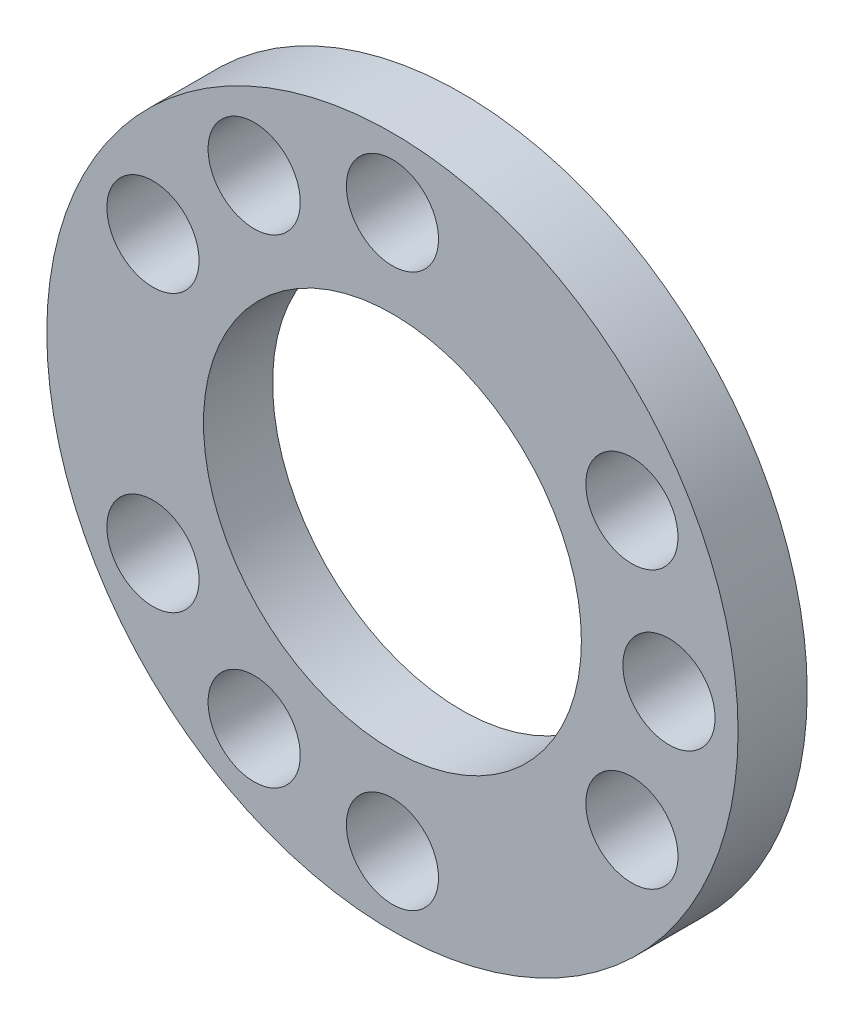
ISO-10303-21;
HEADER;
FILE_DESCRIPTION(('STEP AP214'),'2;1');
FILE_NAME('part.step','',(''),(''),'','','');
FILE_SCHEMA(('AUTOMOTIVE_DESIGN { 1 0 10303 214 1 1 1 1 }'));
ENDSEC;
DATA;
#1=APPLICATION_CONTEXT('core data for automotive mechanical design processes');
#2=APPLICATION_PROTOCOL_DEFINITION('international standard','automotive_design',2000,#1);
#3=PRODUCT_CONTEXT('',#1,'mechanical');
#4=PRODUCT('Part','Part','',(#3));
#5=PRODUCT_RELATED_PRODUCT_CATEGORY('part','',(#4));
#6=PRODUCT_DEFINITION_FORMATION('','',#4);
#7=PRODUCT_DEFINITION_CONTEXT('part definition',#1,'design');
#8=PRODUCT_DEFINITION('design','',#6,#7);
#9=PRODUCT_DEFINITION_SHAPE('','',#8);
#10=(LENGTH_UNIT() NAMED_UNIT(*) SI_UNIT(.MILLI.,.METRE.));
#11=(NAMED_UNIT(*) PLANE_ANGLE_UNIT() SI_UNIT($,.RADIAN.));
#12=(NAMED_UNIT(*) SI_UNIT($,.STERADIAN.) SOLID_ANGLE_UNIT());
#13=UNCERTAINTY_MEASURE_WITH_UNIT(LENGTH_MEASURE(1.E-05),#10,'distance_accuracy_value','');
#14=(GEOMETRIC_REPRESENTATION_CONTEXT(3) GLOBAL_UNCERTAINTY_ASSIGNED_CONTEXT((#13)) GLOBAL_UNIT_ASSIGNED_CONTEXT((#10,
#11,#12)) REPRESENTATION_CONTEXT('',''));
#15=CARTESIAN_POINT('',(0.,0.,0.));
#16=DIRECTION('',(0.,0.,1.));
#17=DIRECTION('',(1.,0.,0.));
#18=AXIS2_PLACEMENT_3D('',#15,#16,#17);
#19=CARTESIAN_POINT('',(0.,0.,7.));
#20=DIRECTION('',(0.,0.,-1.));
#21=DIRECTION('',(-1.,0.,0.));
#22=AXIS2_PLACEMENT_3D('',#19,#20,#21);
#23=CYLINDRICAL_SURFACE('',#22,15.);
#24=CARTESIAN_POINT('',(0.,0.,0.));
#25=DIRECTION('',(0.,0.,1.));
#26=DIRECTION('',(1.,0.,0.));
#27=AXIS2_PLACEMENT_3D('',#24,#25,#26);
#28=CIRCLE('',#27,15.);
#29=CARTESIAN_POINT('',(15.,0.,0.));
#30=VERTEX_POINT('',#29);
#31=EDGE_CURVE('E10',#30,#30,#28,.T.);
#32=ORIENTED_EDGE('',*,*,#31,.T.);
#33=EDGE_LOOP('',(#32));
#34=FACE_BOUND('',#33,.T.);
#35=CARTESIAN_POINT('',(0.,0.,3.));
#36=DIRECTION('',(0.,0.,1.));
#37=DIRECTION('',(1.,0.,0.));
#38=AXIS2_PLACEMENT_3D('',#35,#36,#37);
#39=CIRCLE('',#38,15.);
#40=CARTESIAN_POINT('',(15.,0.,3.));
#41=VERTEX_POINT('',#40);
#42=EDGE_CURVE('E83',#41,#41,#39,.T.);
#43=ORIENTED_EDGE('',*,*,#42,.F.);
#44=EDGE_LOOP('',(#43));
#45=FACE_BOUND('',#44,.T.);
#46=ADVANCED_FACE('F33',(#34,#45),#23,.T.);
#47=CARTESIAN_POINT('',(0.,12.,7.));
#48=DIRECTION('',(0.,0.,-1.));
#49=DIRECTION('',(-1.,0.,0.));
#50=AXIS2_PLACEMENT_3D('',#47,#48,#49);
#51=CYLINDRICAL_SURFACE('',#50,2.);
#52=CARTESIAN_POINT('',(0.,12.,0.));
#53=DIRECTION('',(0.,0.,1.));
#54=DIRECTION('',(1.,0.,0.));
#55=AXIS2_PLACEMENT_3D('',#52,#53,#54);
#56=CIRCLE('',#55,2.);
#57=CARTESIAN_POINT('',(2.,12.,0.));
#58=VERTEX_POINT('',#57);
#59=EDGE_CURVE('E40',#58,#58,#56,.T.);
#60=ORIENTED_EDGE('',*,*,#59,.F.);
#61=EDGE_LOOP('',(#60));
#62=FACE_BOUND('',#61,.T.);
#63=CARTESIAN_POINT('',(0.,12.,3.));
#64=DIRECTION('',(0.,0.,1.));
#65=DIRECTION('',(1.,0.,0.));
#66=AXIS2_PLACEMENT_3D('',#63,#64,#65);
#67=CIRCLE('',#66,2.);
#68=CARTESIAN_POINT('',(2.,12.,3.));
#69=VERTEX_POINT('',#68);
#70=EDGE_CURVE('E80',#69,#69,#67,.T.);
#71=ORIENTED_EDGE('',*,*,#70,.T.);
#72=EDGE_LOOP('',(#71));
#73=FACE_BOUND('',#72,.T.);
#74=ADVANCED_FACE('F116',(#62,#73),#51,.F.);
#75=CARTESIAN_POINT('',(-6.00000000000002,10.3923048454133,7.));
#76=DIRECTION('',(0.,0.,-1.));
#77=DIRECTION('',(-1.,0.,0.));
#78=AXIS2_PLACEMENT_3D('',#75,#76,#77);
#79=CYLINDRICAL_SURFACE('',#78,2.);
#80=CARTESIAN_POINT('',(-6.00000000000002,10.3923048454133,0.));
#81=DIRECTION('',(0.,0.,1.));
#82=DIRECTION('',(1.,0.,0.));
#83=AXIS2_PLACEMENT_3D('',#80,#81,#82);
#84=CIRCLE('',#83,2.);
#85=CARTESIAN_POINT('',(-4.00000000000002,10.3923048454133,0.));
#86=VERTEX_POINT('',#85);
#87=EDGE_CURVE('E45',#86,#86,#84,.T.);
#88=ORIENTED_EDGE('',*,*,#87,.F.);
#89=EDGE_LOOP('',(#88));
#90=FACE_BOUND('',#89,.T.);
#91=CARTESIAN_POINT('',(-6.00000000000002,10.3923048454133,3.));
#92=DIRECTION('',(0.,0.,1.));
#93=DIRECTION('',(1.,0.,0.));
#94=AXIS2_PLACEMENT_3D('',#91,#92,#93);
#95=CIRCLE('',#94,2.);
#96=CARTESIAN_POINT('',(-4.00000000000002,10.3923048454133,3.));
#97=VERTEX_POINT('',#96);
#98=EDGE_CURVE('E77',#97,#97,#95,.T.);
#99=ORIENTED_EDGE('',*,*,#98,.T.);
#100=EDGE_LOOP('',(#99));
#101=FACE_BOUND('',#100,.T.);
#102=ADVANCED_FACE('F112',(#90,#101),#79,.F.);
#103=CARTESIAN_POINT('',(10.3923048454133,6.00000000000059,7.));
#104=DIRECTION('',(0.,0.,-1.));
#105=DIRECTION('',(-1.,0.,0.));
#106=AXIS2_PLACEMENT_3D('',#103,#104,#105);
#107=CYLINDRICAL_SURFACE('',#106,2.00000000000043);
#108=CARTESIAN_POINT('',(10.3923048454133,6.00000000000059,0.));
#109=DIRECTION('',(0.,0.,1.));
#110=DIRECTION('',(1.,0.,0.));
#111=AXIS2_PLACEMENT_3D('',#108,#109,#110);
#112=CIRCLE('',#111,2.00000000000043);
#113=CARTESIAN_POINT('',(12.3923048454137,6.00000000000059,0.));
#114=VERTEX_POINT('',#113);
#115=EDGE_CURVE('E104',#114,#114,#112,.T.);
#116=ORIENTED_EDGE('',*,*,#115,.F.);
#117=EDGE_LOOP('',(#116));
#118=FACE_BOUND('',#117,.T.);
#119=CARTESIAN_POINT('',(10.3923048454133,6.00000000000059,3.));
#120=DIRECTION('',(0.,0.,1.));
#121=DIRECTION('',(1.,0.,0.));
#122=AXIS2_PLACEMENT_3D('',#119,#120,#121);
#123=CIRCLE('',#122,2.00000000000043);
#124=CARTESIAN_POINT('',(12.3923048454137,6.00000000000059,3.));
#125=VERTEX_POINT('',#124);
#126=EDGE_CURVE('E74',#125,#125,#123,.T.);
#127=ORIENTED_EDGE('',*,*,#126,.T.);
#128=EDGE_LOOP('',(#127));
#129=FACE_BOUND('',#128,.T.);
#130=ADVANCED_FACE('F115',(#118,#129),#107,.F.);
#131=CARTESIAN_POINT('',(10.3923048454138,-5.99999999999911,7.));
#132=DIRECTION('',(0.,0.,-1.));
#133=DIRECTION('',(-1.,0.,0.));
#134=AXIS2_PLACEMENT_3D('',#131,#132,#133);
#135=CYLINDRICAL_SURFACE('',#134,2.00000000000103);
#136=CARTESIAN_POINT('',(10.3923048454138,-5.99999999999911,0.));
#137=DIRECTION('',(0.,0.,1.));
#138=DIRECTION('',(1.,0.,0.));
#139=AXIS2_PLACEMENT_3D('',#136,#137,#138);
#140=CIRCLE('',#139,2.00000000000103);
#141=CARTESIAN_POINT('',(12.3923048454148,-5.99999999999911,0.));
#142=VERTEX_POINT('',#141);
#143=EDGE_CURVE('E101',#142,#142,#140,.T.);
#144=ORIENTED_EDGE('',*,*,#143,.F.);
#145=EDGE_LOOP('',(#144));
#146=FACE_BOUND('',#145,.T.);
#147=CARTESIAN_POINT('',(10.3923048454138,-5.99999999999911,3.));
#148=DIRECTION('',(0.,0.,1.));
#149=DIRECTION('',(1.,0.,0.));
#150=AXIS2_PLACEMENT_3D('',#147,#148,#149);
#151=CIRCLE('',#150,2.00000000000103);
#152=CARTESIAN_POINT('',(12.3923048454148,-5.99999999999911,3.));
#153=VERTEX_POINT('',#152);
#154=EDGE_CURVE('E71',#153,#153,#151,.T.);
#155=ORIENTED_EDGE('',*,*,#154,.T.);
#156=EDGE_LOOP('',(#155));
#157=FACE_BOUND('',#156,.T.);
#158=ADVANCED_FACE('F170',(#146,#157),#135,.F.);
#159=CARTESIAN_POINT('',(1.01532524224664E-12,-11.9999999999994,7.));
#160=DIRECTION('',(0.,0.,-1.));
#161=DIRECTION('',(-1.,0.,0.));
#162=AXIS2_PLACEMENT_3D('',#159,#160,#161);
#163=CYLINDRICAL_SURFACE('',#162,2.00000000000123);
#164=CARTESIAN_POINT('',(1.01532524224664E-12,-11.9999999999994,0.));
#165=DIRECTION('',(0.,0.,1.));
#166=DIRECTION('',(1.,0.,0.));
#167=AXIS2_PLACEMENT_3D('',#164,#165,#166);
#168=CIRCLE('',#167,2.00000000000123);
#169=CARTESIAN_POINT('',(2.00000000000224,-11.9999999999994,0.));
#170=VERTEX_POINT('',#169);
#171=EDGE_CURVE('E98',#170,#170,#168,.T.);
#172=ORIENTED_EDGE('',*,*,#171,.F.);
#173=EDGE_LOOP('',(#172));
#174=FACE_BOUND('',#173,.T.);
#175=CARTESIAN_POINT('',(1.01532524224664E-12,-11.9999999999994,3.));
#176=DIRECTION('',(0.,0.,1.));
#177=DIRECTION('',(1.,0.,0.));
#178=AXIS2_PLACEMENT_3D('',#175,#176,#177);
#179=CIRCLE('',#178,2.00000000000123);
#180=CARTESIAN_POINT('',(2.00000000000224,-11.9999999999994,3.));
#181=VERTEX_POINT('',#180);
#182=EDGE_CURVE('E68',#181,#181,#179,.T.);
#183=ORIENTED_EDGE('',*,*,#182,.T.);
#184=EDGE_LOOP('',(#183));
#185=FACE_BOUND('',#184,.T.);
#186=ADVANCED_FACE('F166',(#174,#185),#163,.F.);
#187=CARTESIAN_POINT('',(-10.3923048454122,-6.,7.));
#188=DIRECTION('',(0.,0.,-1.));
#189=DIRECTION('',(-1.,0.,0.));
#190=AXIS2_PLACEMENT_3D('',#187,#188,#189);
#191=CYLINDRICAL_SURFACE('',#190,2.00000000000085);
#192=CARTESIAN_POINT('',(-10.3923048454122,-6.,0.));
#193=DIRECTION('',(0.,0.,1.));
#194=DIRECTION('',(1.,0.,0.));
#195=AXIS2_PLACEMENT_3D('',#192,#193,#194);
#196=CIRCLE('',#195,2.00000000000085);
#197=CARTESIAN_POINT('',(-8.3923048454114,-6.,0.));
#198=VERTEX_POINT('',#197);
#199=EDGE_CURVE('E95',#198,#198,#196,.T.);
#200=ORIENTED_EDGE('',*,*,#199,.F.);
#201=EDGE_LOOP('',(#200));
#202=FACE_BOUND('',#201,.T.);
#203=CARTESIAN_POINT('',(-10.3923048454122,-6.,3.));
#204=DIRECTION('',(0.,0.,1.));
#205=DIRECTION('',(1.,0.,0.));
#206=AXIS2_PLACEMENT_3D('',#203,#204,#205);
#207=CIRCLE('',#206,2.00000000000085);
#208=CARTESIAN_POINT('',(-8.3923048454114,-6.,3.));
#209=VERTEX_POINT('',#208);
#210=EDGE_CURVE('E65',#209,#209,#207,.T.);
#211=ORIENTED_EDGE('',*,*,#210,.T.);
#212=EDGE_LOOP('',(#211));
#213=FACE_BOUND('',#212,.T.);
#214=ADVANCED_FACE('F162',(#202,#213),#191,.F.);
#215=CARTESIAN_POINT('',(-10.3923048454128,5.99999999999971,7.));
#216=DIRECTION('',(0.,0.,-1.));
#217=DIRECTION('',(-1.,0.,0.));
#218=AXIS2_PLACEMENT_3D('',#215,#216,#217);
#219=CYLINDRICAL_SURFACE('',#218,2.00000000000031);
#220=CARTESIAN_POINT('',(-10.3923048454128,5.99999999999971,0.));
#221=DIRECTION('',(0.,0.,1.));
#222=DIRECTION('',(1.,0.,0.));
#223=AXIS2_PLACEMENT_3D('',#220,#221,#222);
#224=CIRCLE('',#223,2.00000000000031);
#225=CARTESIAN_POINT('',(-8.39230484541245,5.99999999999971,0.));
#226=VERTEX_POINT('',#225);
#227=EDGE_CURVE('E92',#226,#226,#224,.T.);
#228=ORIENTED_EDGE('',*,*,#227,.F.);
#229=EDGE_LOOP('',(#228));
#230=FACE_BOUND('',#229,.T.);
#231=CARTESIAN_POINT('',(-10.3923048454128,5.99999999999971,3.));
#232=DIRECTION('',(0.,0.,1.));
#233=DIRECTION('',(1.,0.,0.));
#234=AXIS2_PLACEMENT_3D('',#231,#232,#233);
#235=CIRCLE('',#234,2.00000000000031);
#236=CARTESIAN_POINT('',(-8.39230484541245,5.99999999999971,3.));
#237=VERTEX_POINT('',#236);
#238=EDGE_CURVE('E55',#237,#237,#235,.T.);
#239=ORIENTED_EDGE('',*,*,#238,.T.);
#240=EDGE_LOOP('',(#239));
#241=FACE_BOUND('',#240,.T.);
#242=ADVANCED_FACE('F154',(#230,#241),#219,.F.);
#243=CARTESIAN_POINT('',(12.0000000000004,8.14669512405608E-13,7.));
#244=DIRECTION('',(0.,0.,-1.));
#245=DIRECTION('',(-1.,0.,0.));
#246=AXIS2_PLACEMENT_3D('',#243,#244,#245);
#247=CYLINDRICAL_SURFACE('',#246,2.);
#248=CARTESIAN_POINT('',(12.0000000000004,8.14669512405608E-13,0.));
#249=DIRECTION('',(0.,0.,1.));
#250=DIRECTION('',(1.,0.,0.));
#251=AXIS2_PLACEMENT_3D('',#248,#249,#250);
#252=CIRCLE('',#251,2.);
#253=CARTESIAN_POINT('',(14.0000000000004,8.14669512405608E-13,0.));
#254=VERTEX_POINT('',#253);
#255=EDGE_CURVE('E89',#254,#254,#252,.T.);
#256=ORIENTED_EDGE('',*,*,#255,.F.);
#257=EDGE_LOOP('',(#256));
#258=FACE_BOUND('',#257,.T.);
#259=CARTESIAN_POINT('',(12.0000000000004,8.14669512405608E-13,3.));
#260=DIRECTION('',(0.,0.,1.));
#261=DIRECTION('',(1.,0.,0.));
#262=AXIS2_PLACEMENT_3D('',#259,#260,#261);
#263=CIRCLE('',#262,2.);
#264=CARTESIAN_POINT('',(14.0000000000004,8.14669512405608E-13,3.));
#265=VERTEX_POINT('',#264);
#266=EDGE_CURVE('E50',#265,#265,#263,.T.);
#267=ORIENTED_EDGE('',*,*,#266,.T.);
#268=EDGE_LOOP('',(#267));
#269=FACE_BOUND('',#268,.T.);
#270=ADVANCED_FACE('F146',(#258,#269),#247,.F.);
#271=CARTESIAN_POINT('',(-5.99999999999911,-10.3923048454132,7.));
#272=DIRECTION('',(0.,0.,-1.));
#273=DIRECTION('',(-1.,0.,0.));
#274=AXIS2_PLACEMENT_3D('',#271,#272,#273);
#275=CYLINDRICAL_SURFACE('',#274,2.);
#276=CARTESIAN_POINT('',(-5.99999999999911,-10.3923048454132,0.));
#277=DIRECTION('',(0.,0.,1.));
#278=DIRECTION('',(1.,0.,0.));
#279=AXIS2_PLACEMENT_3D('',#276,#277,#278);
#280=CIRCLE('',#279,2.);
#281=CARTESIAN_POINT('',(-3.99999999999911,-10.3923048454132,0.));
#282=VERTEX_POINT('',#281);
#283=EDGE_CURVE('E86',#282,#282,#280,.T.);
#284=ORIENTED_EDGE('',*,*,#283,.F.);
#285=EDGE_LOOP('',(#284));
#286=FACE_BOUND('',#285,.T.);
#287=CARTESIAN_POINT('',(-5.99999999999911,-10.3923048454132,3.));
#288=DIRECTION('',(0.,0.,1.));
#289=DIRECTION('',(1.,0.,0.));
#290=AXIS2_PLACEMENT_3D('',#287,#288,#289);
#291=CIRCLE('',#290,2.);
#292=CARTESIAN_POINT('',(-3.99999999999911,-10.3923048454132,3.));
#293=VERTEX_POINT('',#292);
#294=EDGE_CURVE('E48',#293,#293,#291,.T.);
#295=ORIENTED_EDGE('',*,*,#294,.T.);
#296=EDGE_LOOP('',(#295));
#297=FACE_BOUND('',#296,.T.);
#298=ADVANCED_FACE('F142',(#286,#297),#275,.F.);
#299=CARTESIAN_POINT('',(0.,0.,0.));
#300=DIRECTION('',(0.,0.,1.));
#301=DIRECTION('',(1.,0.,0.));
#302=AXIS2_PLACEMENT_3D('',#299,#300,#301);
#303=PLANE('',#302);
#304=CARTESIAN_POINT('',(0.,0.,0.));
#305=DIRECTION('',(0.,0.,1.));
#306=DIRECTION('',(1.,0.,0.));
#307=AXIS2_PLACEMENT_3D('',#304,#305,#306);
#308=CIRCLE('',#307,8.2);
#309=CARTESIAN_POINT('',(8.2,0.,0.));
#310=VERTEX_POINT('',#309);
#311=EDGE_CURVE('E51',#310,#310,#308,.T.);
#312=ORIENTED_EDGE('',*,*,#311,.T.);
#313=EDGE_LOOP('',(#312));
#314=FACE_BOUND('',#313,.T.);
#315=ORIENTED_EDGE('',*,*,#31,.F.);
#316=EDGE_LOOP('',(#315));
#317=FACE_BOUND('',#316,.T.);
#318=ORIENTED_EDGE('',*,*,#59,.T.);
#319=EDGE_LOOP('',(#318));
#320=FACE_BOUND('',#319,.T.);
#321=ORIENTED_EDGE('',*,*,#87,.T.);
#322=EDGE_LOOP('',(#321));
#323=FACE_BOUND('',#322,.T.);
#324=ORIENTED_EDGE('',*,*,#115,.T.);
#325=EDGE_LOOP('',(#324));
#326=FACE_BOUND('',#325,.T.);
#327=ORIENTED_EDGE('',*,*,#143,.T.);
#328=EDGE_LOOP('',(#327));
#329=FACE_BOUND('',#328,.T.);
#330=ORIENTED_EDGE('',*,*,#171,.T.);
#331=EDGE_LOOP('',(#330));
#332=FACE_BOUND('',#331,.T.);
#333=ORIENTED_EDGE('',*,*,#199,.T.);
#334=EDGE_LOOP('',(#333));
#335=FACE_BOUND('',#334,.T.);
#336=ORIENTED_EDGE('',*,*,#227,.T.);
#337=EDGE_LOOP('',(#336));
#338=FACE_BOUND('',#337,.T.);
#339=ORIENTED_EDGE('',*,*,#255,.T.);
#340=EDGE_LOOP('',(#339));
#341=FACE_BOUND('',#340,.T.);
#342=ORIENTED_EDGE('',*,*,#283,.T.);
#343=EDGE_LOOP('',(#342));
#344=FACE_BOUND('',#343,.T.);
#345=ADVANCED_FACE('F109',(#314,#317,#320,#323,#326,#329,#332,#335,#338,#341,#344),#303,.F.);
#346=CARTESIAN_POINT('',(0.,0.,3.));
#347=DIRECTION('',(0.,0.,1.));
#348=DIRECTION('',(1.,0.,0.));
#349=AXIS2_PLACEMENT_3D('',#346,#347,#348);
#350=PLANE('',#349);
#351=CARTESIAN_POINT('',(0.,0.,3.));
#352=DIRECTION('',(0.,0.,1.));
#353=DIRECTION('',(1.,0.,0.));
#354=AXIS2_PLACEMENT_3D('',#351,#352,#353);
#355=CIRCLE('',#354,8.2);
#356=CARTESIAN_POINT('',(8.2,0.,3.));
#357=VERTEX_POINT('',#356);
#358=EDGE_CURVE('E36',#357,#357,#355,.T.);
#359=ORIENTED_EDGE('',*,*,#358,.F.);
#360=EDGE_LOOP('',(#359));
#361=FACE_BOUND('',#360,.T.);
#362=ORIENTED_EDGE('',*,*,#294,.F.);
#363=EDGE_LOOP('',(#362));
#364=FACE_BOUND('',#363,.T.);
#365=ORIENTED_EDGE('',*,*,#266,.F.);
#366=EDGE_LOOP('',(#365));
#367=FACE_BOUND('',#366,.T.);
#368=ORIENTED_EDGE('',*,*,#238,.F.);
#369=EDGE_LOOP('',(#368));
#370=FACE_BOUND('',#369,.T.);
#371=ORIENTED_EDGE('',*,*,#210,.F.);
#372=EDGE_LOOP('',(#371));
#373=FACE_BOUND('',#372,.T.);
#374=ORIENTED_EDGE('',*,*,#182,.F.);
#375=EDGE_LOOP('',(#374));
#376=FACE_BOUND('',#375,.T.);
#377=ORIENTED_EDGE('',*,*,#154,.F.);
#378=EDGE_LOOP('',(#377));
#379=FACE_BOUND('',#378,.T.);
#380=ORIENTED_EDGE('',*,*,#126,.F.);
#381=EDGE_LOOP('',(#380));
#382=FACE_BOUND('',#381,.T.);
#383=ORIENTED_EDGE('',*,*,#98,.F.);
#384=EDGE_LOOP('',(#383));
#385=FACE_BOUND('',#384,.T.);
#386=ORIENTED_EDGE('',*,*,#70,.F.);
#387=EDGE_LOOP('',(#386));
#388=FACE_BOUND('',#387,.T.);
#389=ORIENTED_EDGE('',*,*,#42,.T.);
#390=EDGE_LOOP('',(#389));
#391=FACE_BOUND('',#390,.T.);
#392=ADVANCED_FACE('F120',(#361,#364,#367,#370,#373,#376,#379,#382,#385,#388,#391),#350,.T.);
#393=CARTESIAN_POINT('',(0.,0.,-13.));
#394=DIRECTION('',(0.,0.,1.));
#395=DIRECTION('',(1.,0.,0.));
#396=AXIS2_PLACEMENT_3D('',#393,#394,#395);
#397=CYLINDRICAL_SURFACE('',#396,8.2);
#398=CARTESIAN_POINT('',(8.2,0.,3.));
#399=CARTESIAN_POINT('',(8.2,0.,2.96875));
#400=CARTESIAN_POINT('',(8.2,0.,2.9375));
#401=CARTESIAN_POINT('',(8.2,0.,2.875));
#402=CARTESIAN_POINT('',(8.2,0.,2.84375));
#403=CARTESIAN_POINT('',(8.2,0.,2.78125));
#404=CARTESIAN_POINT('',(8.2,0.,2.75));
#405=CARTESIAN_POINT('',(8.2,0.,2.6875));
#406=CARTESIAN_POINT('',(8.2,0.,2.65625));
#407=CARTESIAN_POINT('',(8.2,0.,2.59375));
#408=CARTESIAN_POINT('',(8.2,0.,2.5625));
#409=CARTESIAN_POINT('',(8.2,0.,2.5));
#410=CARTESIAN_POINT('',(8.2,0.,2.46875));
#411=CARTESIAN_POINT('',(8.2,0.,2.40625));
#412=CARTESIAN_POINT('',(8.2,0.,2.375));
#413=CARTESIAN_POINT('',(8.2,0.,2.3125));
#414=CARTESIAN_POINT('',(8.2,0.,2.28125));
#415=CARTESIAN_POINT('',(8.2,0.,2.21875));
#416=CARTESIAN_POINT('',(8.2,0.,2.1875));
#417=CARTESIAN_POINT('',(8.2,0.,2.125));
#418=CARTESIAN_POINT('',(8.2,0.,2.09375));
#419=CARTESIAN_POINT('',(8.2,0.,2.03125));
#420=CARTESIAN_POINT('',(8.2,0.,2.));
#421=CARTESIAN_POINT('',(8.2,0.,1.9375));
#422=CARTESIAN_POINT('',(8.2,0.,1.90625));
#423=CARTESIAN_POINT('',(8.2,0.,1.84375));
#424=CARTESIAN_POINT('',(8.2,0.,1.8125));
#425=CARTESIAN_POINT('',(8.2,0.,1.75));
#426=CARTESIAN_POINT('',(8.2,0.,1.71875));
#427=CARTESIAN_POINT('',(8.2,0.,1.65625));
#428=CARTESIAN_POINT('',(8.2,0.,1.625));
#429=CARTESIAN_POINT('',(8.2,0.,1.5625));
#430=CARTESIAN_POINT('',(8.2,0.,1.53125));
#431=CARTESIAN_POINT('',(8.2,0.,1.46875));
#432=CARTESIAN_POINT('',(8.2,0.,1.4375));
#433=CARTESIAN_POINT('',(8.2,0.,1.375));
#434=CARTESIAN_POINT('',(8.2,0.,1.34375));
#435=CARTESIAN_POINT('',(8.2,0.,1.28125));
#436=CARTESIAN_POINT('',(8.2,0.,1.25));
#437=CARTESIAN_POINT('',(8.2,0.,1.1875));
#438=CARTESIAN_POINT('',(8.2,0.,1.15625));
#439=CARTESIAN_POINT('',(8.2,0.,1.09375));
#440=CARTESIAN_POINT('',(8.2,0.,1.0625));
#441=CARTESIAN_POINT('',(8.2,0.,0.999999999999999));
#442=CARTESIAN_POINT('',(8.2,0.,0.968749999999999));
#443=CARTESIAN_POINT('',(8.2,0.,0.906249999999999));
#444=CARTESIAN_POINT('',(8.2,0.,0.874999999999999));
#445=CARTESIAN_POINT('',(8.2,0.,0.812499999999999));
#446=CARTESIAN_POINT('',(8.2,0.,0.781249999999999));
#447=CARTESIAN_POINT('',(8.2,0.,0.718749999999999));
#448=CARTESIAN_POINT('',(8.2,0.,0.687499999999999));
#449=CARTESIAN_POINT('',(8.2,0.,0.624999999999999));
#450=CARTESIAN_POINT('',(8.2,0.,0.593749999999999));
#451=CARTESIAN_POINT('',(8.2,0.,0.531249999999999));
#452=CARTESIAN_POINT('',(8.2,0.,0.499999999999999));
#453=CARTESIAN_POINT('',(8.2,0.,0.437499999999999));
#454=CARTESIAN_POINT('',(8.2,0.,0.406249999999999));
#455=CARTESIAN_POINT('',(8.2,0.,0.343749999999999));
#456=CARTESIAN_POINT('',(8.2,0.,0.312499999999999));
#457=CARTESIAN_POINT('',(8.2,0.,0.249999999999999));
#458=CARTESIAN_POINT('',(8.2,0.,0.218749999999998));
#459=CARTESIAN_POINT('',(8.2,0.,0.156249999999998));
#460=CARTESIAN_POINT('',(8.2,0.,0.124999999999998));
#461=CARTESIAN_POINT('',(8.2,0.,0.0624999999999983));
#462=CARTESIAN_POINT('',(8.2,0.,0.0312499999999983));
#463=CARTESIAN_POINT('',(8.2,0.,0.));
#464=B_SPLINE_CURVE_WITH_KNOTS('',3,(#398,#399,#400,#401,#402,#403,#404,#405,#406,#407,#408,
#409,#410,#411,#412,#413,#414,#415,#416,#417,#418,#419,#420,#421,#422,#423,#424,#425,#426,#427,
#428,#429,#430,#431,#432,#433,#434,#435,#436,#437,#438,#439,#440,#441,#442,#443,#444,#445,#446,
#447,#448,#449,#450,#451,#452,#453,#454,#455,#456,#457,#458,#459,#460,#461,#462,#463),
.UNSPECIFIED.,.F.,.F.,(4,2,2,2,2,2,2,2,2,2,2,2,2,2,2,2,2,2,2,2,2,2,2,2,2,2,2,2,2,2,2,2,4),(0.,
0.0937500000000001,0.1875,0.28125,0.374999999999999,0.468749999999999,0.562499999999999,
0.656249999999999,0.749999999999999,0.843749999999999,0.937499999999999,1.03125,1.125,1.21875,
1.3125,1.40625,1.5,1.59375,1.6875,1.78125,1.875,1.96875,2.0625,2.15625,2.25,2.34375,2.4375,
2.53125,2.625,2.71875,2.8125,2.90625,3.),.UNSPECIFIED.);
#465=EDGE_CURVE('BSEAM123',#357,#310,#464,.T.);
#466=ORIENTED_EDGE('',*,*,#358,.T.);
#467=ORIENTED_EDGE('',*,*,#311,.F.);
#468=ORIENTED_EDGE('',*,*,#465,.T.);
#469=ORIENTED_EDGE('',*,*,#465,.F.);
#470=EDGE_LOOP('',(#466,#468,#467,#469));
#471=FACE_BOUND('',#470,.T.);
#472=ADVANCED_FACE('F123',(#471),#397,.F.);
#473=CLOSED_SHELL('',(#46,#74,#102,#130,#158,#186,#214,#242,#270,#298,#345,#392,#472));
#474=MANIFOLD_SOLID_BREP('B2',#473);
#475=ADVANCED_BREP_SHAPE_REPRESENTATION('',(#18,#474),#14);
#476=SHAPE_DEFINITION_REPRESENTATION(#9,#475);
ENDSEC;
END-ISO-10303-21;
